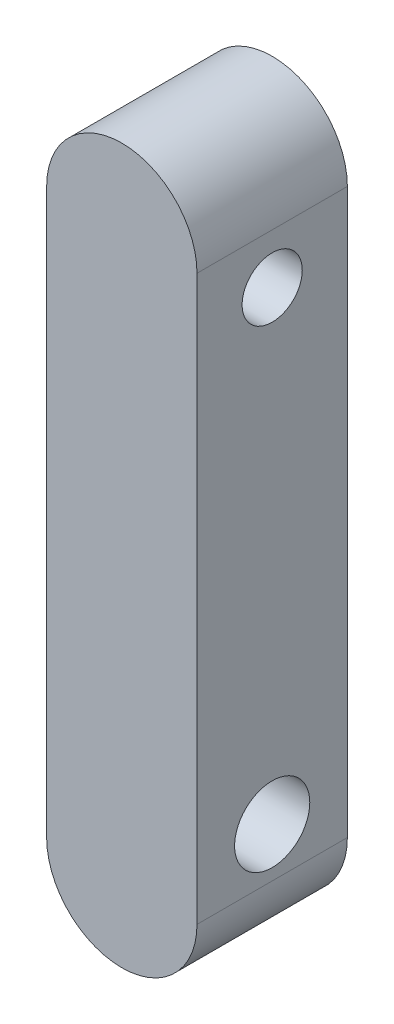
ISO-10303-21;
HEADER;
FILE_DESCRIPTION(('STEP AP214'),'2;1');
FILE_NAME('part.step','',(''),(''),'','','');
FILE_SCHEMA(('AUTOMOTIVE_DESIGN { 1 0 10303 214 1 1 1 1 }'));
ENDSEC;
DATA;
#1=APPLICATION_CONTEXT('core data for automotive mechanical design processes');
#2=APPLICATION_PROTOCOL_DEFINITION('international standard','automotive_design',2000,#1);
#3=PRODUCT_CONTEXT('',#1,'mechanical');
#4=PRODUCT('Part','Part','',(#3));
#5=PRODUCT_RELATED_PRODUCT_CATEGORY('part','',(#4));
#6=PRODUCT_DEFINITION_FORMATION('','',#4);
#7=PRODUCT_DEFINITION_CONTEXT('part definition',#1,'design');
#8=PRODUCT_DEFINITION('design','',#6,#7);
#9=PRODUCT_DEFINITION_SHAPE('','',#8);
#10=(LENGTH_UNIT() NAMED_UNIT(*) SI_UNIT(.MILLI.,.METRE.));
#11=(NAMED_UNIT(*) PLANE_ANGLE_UNIT() SI_UNIT($,.RADIAN.));
#12=(NAMED_UNIT(*) SI_UNIT($,.STERADIAN.) SOLID_ANGLE_UNIT());
#13=UNCERTAINTY_MEASURE_WITH_UNIT(LENGTH_MEASURE(1.E-05),#10,'distance_accuracy_value','');
#14=(GEOMETRIC_REPRESENTATION_CONTEXT(3) GLOBAL_UNCERTAINTY_ASSIGNED_CONTEXT((#13)) GLOBAL_UNIT_ASSIGNED_CONTEXT((#10,
#11,#12)) REPRESENTATION_CONTEXT('',''));
#15=CARTESIAN_POINT('',(0.,0.,0.));
#16=DIRECTION('',(0.,0.,1.));
#17=DIRECTION('',(1.,0.,0.));
#18=AXIS2_PLACEMENT_3D('',#15,#16,#17);
#19=CARTESIAN_POINT('',(0.,0.,20.));
#20=DIRECTION('',(0.,0.,1.));
#21=DIRECTION('',(1.,0.,0.));
#22=AXIS2_PLACEMENT_3D('',#19,#20,#21);
#23=PLANE('',#22);
#24=CARTESIAN_POINT('',(0.,0.,20.));
#25=DIRECTION('',(0.,0.,1.));
#26=DIRECTION('',(1.,0.,0.));
#27=AXIS2_PLACEMENT_3D('',#24,#25,#26);
#28=CIRCLE('',#27,10.);
#29=CARTESIAN_POINT('',(-10.,0.,20.));
#30=VERTEX_POINT('',#29);
#31=CARTESIAN_POINT('',(10.,0.,20.));
#32=VERTEX_POINT('',#31);
#33=EDGE_CURVE('E92',#30,#32,#28,.T.);
#34=ORIENTED_EDGE('',*,*,#33,.T.);
#35=DIRECTION('',(0.,1.,0.));
#36=VECTOR('',#35,1.);
#37=CARTESIAN_POINT('',(10.,0.,20.));
#38=LINE('',#37,#36);
#39=CARTESIAN_POINT('',(10.,75.,20.));
#40=VERTEX_POINT('',#39);
#41=EDGE_CURVE('E88',#32,#40,#38,.T.);
#42=ORIENTED_EDGE('',*,*,#41,.T.);
#43=CARTESIAN_POINT('',(0.,75.,20.));
#44=DIRECTION('',(0.,0.,1.));
#45=DIRECTION('',(1.,0.,0.));
#46=AXIS2_PLACEMENT_3D('',#43,#44,#45);
#47=CIRCLE('',#46,10.);
#48=CARTESIAN_POINT('',(-10.,75.,20.));
#49=VERTEX_POINT('',#48);
#50=EDGE_CURVE('E90',#40,#49,#47,.T.);
#51=ORIENTED_EDGE('',*,*,#50,.T.);
#52=DIRECTION('',(0.,-1.,0.));
#53=VECTOR('',#52,1.);
#54=CARTESIAN_POINT('',(-10.,0.,20.));
#55=LINE('',#54,#53);
#56=EDGE_CURVE('E58',#49,#30,#55,.T.);
#57=ORIENTED_EDGE('',*,*,#56,.T.);
#58=EDGE_LOOP('',(#34,#42,#51,#57));
#59=FACE_BOUND('',#58,.T.);
#60=ADVANCED_FACE('F39',(#59),#23,.T.);
#61=CARTESIAN_POINT('',(0.,0.,0.));
#62=DIRECTION('',(0.,0.,1.));
#63=DIRECTION('',(1.,0.,0.));
#64=AXIS2_PLACEMENT_3D('',#61,#62,#63);
#65=PLANE('',#64);
#66=CARTESIAN_POINT('',(0.,0.,0.));
#67=DIRECTION('',(0.,0.,1.));
#68=DIRECTION('',(1.,0.,0.));
#69=AXIS2_PLACEMENT_3D('',#66,#67,#68);
#70=CIRCLE('',#69,10.);
#71=CARTESIAN_POINT('',(-10.,0.,0.));
#72=VERTEX_POINT('',#71);
#73=CARTESIAN_POINT('',(10.,0.,0.));
#74=VERTEX_POINT('',#73);
#75=EDGE_CURVE('E109',#72,#74,#70,.T.);
#76=ORIENTED_EDGE('',*,*,#75,.F.);
#77=DIRECTION('',(0.,-1.,0.));
#78=VECTOR('',#77,1.);
#79=CARTESIAN_POINT('',(-10.,0.,0.));
#80=LINE('',#79,#78);
#81=CARTESIAN_POINT('',(-10.,75.,0.));
#82=VERTEX_POINT('',#81);
#83=EDGE_CURVE('E81',#82,#72,#80,.T.);
#84=ORIENTED_EDGE('',*,*,#83,.F.);
#85=CARTESIAN_POINT('',(0.,75.,0.));
#86=DIRECTION('',(0.,0.,1.));
#87=DIRECTION('',(1.,0.,0.));
#88=AXIS2_PLACEMENT_3D('',#85,#86,#87);
#89=CIRCLE('',#88,10.);
#90=CARTESIAN_POINT('',(10.,75.,0.));
#91=VERTEX_POINT('',#90);
#92=EDGE_CURVE('E75',#91,#82,#89,.T.);
#93=ORIENTED_EDGE('',*,*,#92,.F.);
#94=DIRECTION('',(0.,1.,0.));
#95=VECTOR('',#94,1.);
#96=CARTESIAN_POINT('',(10.,0.,0.));
#97=LINE('',#96,#95);
#98=EDGE_CURVE('E97',#74,#91,#97,.T.);
#99=ORIENTED_EDGE('',*,*,#98,.F.);
#100=EDGE_LOOP('',(#76,#84,#93,#99));
#101=FACE_BOUND('',#100,.T.);
#102=ADVANCED_FACE('F125',(#101),#65,.F.);
#103=CARTESIAN_POINT('',(0.,0.,20.));
#104=DIRECTION('',(0.,0.,-1.));
#105=DIRECTION('',(-1.,0.,0.));
#106=AXIS2_PLACEMENT_3D('',#103,#104,#105);
#107=CYLINDRICAL_SURFACE('',#106,10.);
#108=ORIENTED_EDGE('',*,*,#75,.T.);
#109=DIRECTION('',(0.,0.,-1.));
#110=VECTOR('',#109,1.);
#111=CARTESIAN_POINT('',(10.,0.,20.));
#112=LINE('',#111,#110);
#113=EDGE_CURVE('E11',#32,#74,#112,.T.);
#114=ORIENTED_EDGE('',*,*,#113,.F.);
#115=ORIENTED_EDGE('',*,*,#33,.F.);
#116=DIRECTION('',(0.,0.,-1.));
#117=VECTOR('',#116,1.);
#118=CARTESIAN_POINT('',(-10.,0.,20.));
#119=LINE('',#118,#117);
#120=EDGE_CURVE('E105',#30,#72,#119,.T.);
#121=ORIENTED_EDGE('',*,*,#120,.T.);
#122=EDGE_LOOP('',(#108,#114,#115,#121));
#123=FACE_BOUND('',#122,.T.);
#124=ADVANCED_FACE('F41',(#123),#107,.T.);
#125=CARTESIAN_POINT('',(10.,0.,20.));
#126=DIRECTION('',(-1.,0.,0.));
#127=DIRECTION('',(0.,0.,1.));
#128=AXIS2_PLACEMENT_3D('',#125,#126,#127);
#129=PLANE('',#128);
#130=CARTESIAN_POINT('',(10.,6.54,10.));
#131=DIRECTION('',(1.,0.,0.));
#132=DIRECTION('',(0.,0.,-1.));
#133=AXIS2_PLACEMENT_3D('',#130,#131,#132);
#134=CIRCLE('',#133,5.);
#135=CARTESIAN_POINT('',(10.,6.54,5.));
#136=VERTEX_POINT('',#135);
#137=EDGE_CURVE('E137',#136,#136,#134,.T.);
#138=ORIENTED_EDGE('',*,*,#137,.F.);
#139=EDGE_LOOP('',(#138));
#140=FACE_BOUND('',#139,.T.);
#141=CARTESIAN_POINT('',(10.,68.36,10.));
#142=DIRECTION('',(1.,0.,0.));
#143=DIRECTION('',(0.,0.,-1.));
#144=AXIS2_PLACEMENT_3D('',#141,#142,#143);
#145=CIRCLE('',#144,4.);
#146=CARTESIAN_POINT('',(10.,68.36,6.));
#147=VERTEX_POINT('',#146);
#148=EDGE_CURVE('E129',#147,#147,#145,.T.);
#149=ORIENTED_EDGE('',*,*,#148,.F.);
#150=EDGE_LOOP('',(#149));
#151=FACE_BOUND('',#150,.T.);
#152=ORIENTED_EDGE('',*,*,#98,.T.);
#153=DIRECTION('',(0.,0.,-1.));
#154=VECTOR('',#153,1.);
#155=CARTESIAN_POINT('',(10.,75.,20.));
#156=LINE('',#155,#154);
#157=EDGE_CURVE('E50',#40,#91,#156,.T.);
#158=ORIENTED_EDGE('',*,*,#157,.F.);
#159=ORIENTED_EDGE('',*,*,#41,.F.);
#160=ORIENTED_EDGE('',*,*,#113,.T.);
#161=EDGE_LOOP('',(#152,#158,#159,#160));
#162=FACE_BOUND('',#161,.T.);
#163=ADVANCED_FACE('F96',(#140,#151,#162),#129,.F.);
#164=CARTESIAN_POINT('',(0.,75.,20.));
#165=DIRECTION('',(0.,0.,-1.));
#166=DIRECTION('',(-1.,0.,0.));
#167=AXIS2_PLACEMENT_3D('',#164,#165,#166);
#168=CYLINDRICAL_SURFACE('',#167,10.);
#169=ORIENTED_EDGE('',*,*,#92,.T.);
#170=DIRECTION('',(0.,0.,-1.));
#171=VECTOR('',#170,1.);
#172=CARTESIAN_POINT('',(-10.,75.,20.));
#173=LINE('',#172,#171);
#174=EDGE_CURVE('E99',#49,#82,#173,.T.);
#175=ORIENTED_EDGE('',*,*,#174,.F.);
#176=ORIENTED_EDGE('',*,*,#50,.F.);
#177=ORIENTED_EDGE('',*,*,#157,.T.);
#178=EDGE_LOOP('',(#169,#175,#176,#177));
#179=FACE_BOUND('',#178,.T.);
#180=ADVANCED_FACE('F101',(#179),#168,.T.);
#181=CARTESIAN_POINT('',(-10.,0.,20.));
#182=DIRECTION('',(1.,0.,0.));
#183=DIRECTION('',(0.,0.,-1.));
#184=AXIS2_PLACEMENT_3D('',#181,#182,#183);
#185=PLANE('',#184);
#186=CARTESIAN_POINT('',(-10.,6.54,10.));
#187=DIRECTION('',(1.,0.,0.));
#188=DIRECTION('',(0.,0.,-1.));
#189=AXIS2_PLACEMENT_3D('',#186,#187,#188);
#190=CIRCLE('',#189,5.);
#191=CARTESIAN_POINT('',(-10.,6.54,5.));
#192=VERTEX_POINT('',#191);
#193=EDGE_CURVE('E133',#192,#192,#190,.T.);
#194=ORIENTED_EDGE('',*,*,#193,.T.);
#195=EDGE_LOOP('',(#194));
#196=FACE_BOUND('',#195,.T.);
#197=CARTESIAN_POINT('',(-10.,68.36,10.));
#198=DIRECTION('',(1.,0.,0.));
#199=DIRECTION('',(0.,0.,-1.));
#200=AXIS2_PLACEMENT_3D('',#197,#198,#199);
#201=CIRCLE('',#200,4.);
#202=CARTESIAN_POINT('',(-10.,68.36,6.));
#203=VERTEX_POINT('',#202);
#204=EDGE_CURVE('E43',#203,#203,#201,.T.);
#205=ORIENTED_EDGE('',*,*,#204,.T.);
#206=EDGE_LOOP('',(#205));
#207=FACE_BOUND('',#206,.T.);
#208=ORIENTED_EDGE('',*,*,#83,.T.);
#209=ORIENTED_EDGE('',*,*,#120,.F.);
#210=ORIENTED_EDGE('',*,*,#56,.F.);
#211=ORIENTED_EDGE('',*,*,#174,.T.);
#212=EDGE_LOOP('',(#208,#209,#210,#211));
#213=FACE_BOUND('',#212,.T.);
#214=ADVANCED_FACE('F122',(#196,#207,#213),#185,.F.);
#215=CARTESIAN_POINT('',(-18.,68.36,10.));
#216=DIRECTION('',(1.,0.,0.));
#217=DIRECTION('',(0.,0.,-1.));
#218=AXIS2_PLACEMENT_3D('',#215,#216,#217);
#219=CYLINDRICAL_SURFACE('',#218,4.);
#220=ORIENTED_EDGE('',*,*,#148,.T.);
#221=EDGE_LOOP('',(#220));
#222=FACE_BOUND('',#221,.T.);
#223=ORIENTED_EDGE('',*,*,#204,.F.);
#224=EDGE_LOOP('',(#223));
#225=FACE_BOUND('',#224,.T.);
#226=ADVANCED_FACE('F149',(#222,#225),#219,.F.);
#227=CARTESIAN_POINT('',(-20.,6.54,10.));
#228=DIRECTION('',(1.,0.,0.));
#229=DIRECTION('',(0.,0.,-1.));
#230=AXIS2_PLACEMENT_3D('',#227,#228,#229);
#231=CYLINDRICAL_SURFACE('',#230,5.);
#232=ORIENTED_EDGE('',*,*,#137,.T.);
#233=EDGE_LOOP('',(#232));
#234=FACE_BOUND('',#233,.T.);
#235=ORIENTED_EDGE('',*,*,#193,.F.);
#236=EDGE_LOOP('',(#235));
#237=FACE_BOUND('',#236,.T.);
#238=ADVANCED_FACE('F142',(#234,#237),#231,.F.);
#239=CLOSED_SHELL('',(#60,#102,#124,#163,#180,#214,#226,#238));
#240=MANIFOLD_SOLID_BREP('B2',#239);
#241=ADVANCED_BREP_SHAPE_REPRESENTATION('',(#18,#240),#14);
#242=SHAPE_DEFINITION_REPRESENTATION(#9,#241);
ENDSEC;
END-ISO-10303-21;
